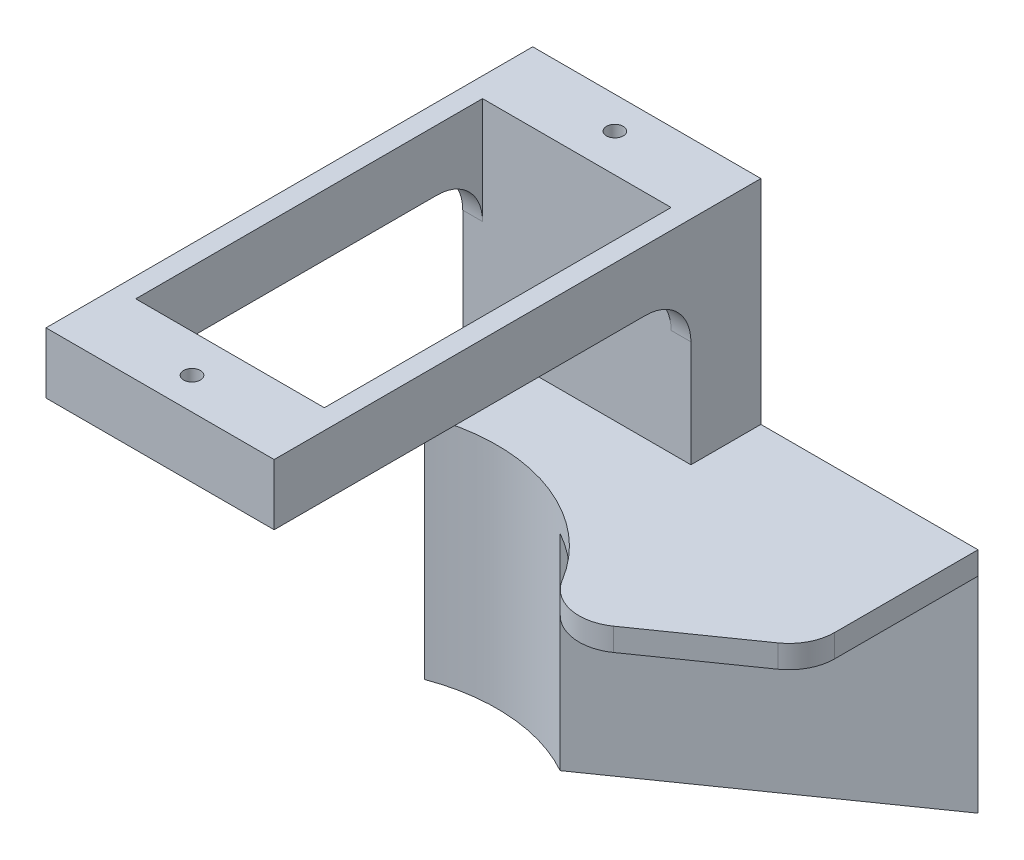
ISO-10303-21;
HEADER;
FILE_DESCRIPTION(('STEP AP214'),'2;1');
FILE_NAME('part.step','',(''),(''),'','','');
FILE_SCHEMA(('AUTOMOTIVE_DESIGN { 1 0 10303 214 1 1 1 1 }'));
ENDSEC;
DATA;
#1=APPLICATION_CONTEXT('core data for automotive mechanical design processes');
#2=APPLICATION_PROTOCOL_DEFINITION('international standard','automotive_design',2000,#1);
#3=PRODUCT_CONTEXT('',#1,'mechanical');
#4=PRODUCT('Part','Part','',(#3));
#5=PRODUCT_RELATED_PRODUCT_CATEGORY('part','',(#4));
#6=PRODUCT_DEFINITION_FORMATION('','',#4);
#7=PRODUCT_DEFINITION_CONTEXT('part definition',#1,'design');
#8=PRODUCT_DEFINITION('design','',#6,#7);
#9=PRODUCT_DEFINITION_SHAPE('','',#8);
#10=(LENGTH_UNIT() NAMED_UNIT(*) SI_UNIT(.MILLI.,.METRE.));
#11=(NAMED_UNIT(*) PLANE_ANGLE_UNIT() SI_UNIT($,.RADIAN.));
#12=(NAMED_UNIT(*) SI_UNIT($,.STERADIAN.) SOLID_ANGLE_UNIT());
#13=UNCERTAINTY_MEASURE_WITH_UNIT(LENGTH_MEASURE(1.E-05),#10,'distance_accuracy_value','');
#14=(GEOMETRIC_REPRESENTATION_CONTEXT(3) GLOBAL_UNCERTAINTY_ASSIGNED_CONTEXT((#13)) GLOBAL_UNIT_ASSIGNED_CONTEXT((#10,
#11,#12)) REPRESENTATION_CONTEXT('',''));
#15=CARTESIAN_POINT('',(0.,0.,0.));
#16=DIRECTION('',(0.,0.,1.));
#17=DIRECTION('',(1.,0.,0.));
#18=AXIS2_PLACEMENT_3D('',#15,#16,#17);
#19=CARTESIAN_POINT('',(0.,-14.5,14.5));
#20=DIRECTION('',(0.,-1.,0.));
#21=DIRECTION('',(1.,0.,0.));
#22=AXIS2_PLACEMENT_3D('',#19,#20,#21);
#23=PLANE('',#22);
#24=DIRECTION('',(1.,0.,0.));
#25=VECTOR('',#24,1.);
#26=CARTESIAN_POINT('',(0.,-14.4999999999999,-1.50000000000005));
#27=LINE('',#26,#25);
#28=CARTESIAN_POINT('',(-7.5,-14.4999999999999,-1.50000000000005));
#29=VERTEX_POINT('',#28);
#30=CARTESIAN_POINT('',(21.7737259658386,-14.4999999999999,-1.50000000000005));
#31=VERTEX_POINT('',#30);
#32=EDGE_CURVE('E258',#29,#31,#27,.T.);
#33=ORIENTED_EDGE('',*,*,#32,.T.);
#34=DIRECTION('',(-0.819152044288991,0.,0.573576436351047));
#35=VECTOR('',#34,1.);
#36=CARTESIAN_POINT('',(-0.354204421152927,-14.5,13.9941436619512));
#37=LINE('',#36,#35);
#38=CARTESIAN_POINT('',(5.61538547792866,-14.5,9.81419181459366));
#39=VERTEX_POINT('',#38);
#40=EDGE_CURVE('E220',#31,#39,#37,.T.);
#41=ORIENTED_EDGE('',*,*,#40,.T.);
#42=CARTESIAN_POINT('',(0.,-14.5,19.85));
#43=DIRECTION('',(0.,-1.,0.));
#44=DIRECTION('',(1.,0.,0.));
#45=AXIS2_PLACEMENT_3D('',#42,#43,#44);
#46=CIRCLE('',#45,11.5);
#47=CARTESIAN_POINT('',(-4.04469791424314,-14.5,9.08475876802948));
#48=VERTEX_POINT('',#47);
#49=EDGE_CURVE('E208',#48,#39,#46,.T.);
#50=ORIENTED_EDGE('',*,*,#49,.F.);
#51=DIRECTION('',(-0.500000000000004,0.,-0.866025403784436));
#52=VECTOR('',#51,1.);
#53=CARTESIAN_POINT('',(-0.688655198428643,-14.5,14.8975952641916));
#54=LINE('',#53,#52);
#55=CARTESIAN_POINT('',(-7.5,-14.5,3.09999999999995));
#56=VERTEX_POINT('',#55);
#57=EDGE_CURVE('E210',#48,#56,#54,.T.);
#58=ORIENTED_EDGE('',*,*,#57,.T.);
#59=DIRECTION('',(0.,0.,-1.));
#60=VECTOR('',#59,1.);
#61=CARTESIAN_POINT('',(-7.5,-14.5,14.4999999999999));
#62=LINE('',#61,#60);
#63=EDGE_CURVE('E249',#56,#29,#62,.T.);
#64=ORIENTED_EDGE('',*,*,#63,.T.);
#65=EDGE_LOOP('',(#33,#41,#50,#58,#64));
#66=FACE_BOUND('',#65,.T.);
#67=ADVANCED_FACE('F47',(#66),#23,.T.);
#68=CARTESIAN_POINT('',(4.8079835060065,-49.0987169715613,21.366512060552));
#69=DIRECTION('',(0.573576436351047,0.,0.819152044288991));
#70=DIRECTION('',(-0.819152044288991,0.,0.573576436351047));
#71=AXIS2_PLACEMENT_3D('',#68,#69,#70);
#72=PLANE('',#71);
#73=DIRECTION('',(-0.819152044288991,0.,0.573576436351047));
#74=VECTOR('',#73,1.);
#75=CARTESIAN_POINT('',(4.8079835060065,-1.00000000000003,21.3665120605521));
#76=LINE('',#75,#74);
#77=CARTESIAN_POINT('',(20.4944552748917,-0.999999999999987,10.3827262800648));
#78=VERTEX_POINT('',#77);
#79=CARTESIAN_POINT('',(14.1437300983189,-1.,14.8295519217994));
#80=VERTEX_POINT('',#79);
#81=EDGE_CURVE('E203',#78,#80,#76,.T.);
#82=ORIENTED_EDGE('',*,*,#81,.F.);
#83=DIRECTION('',(0.,1.,0.));
#84=VECTOR('',#83,1.);
#85=CARTESIAN_POINT('',(20.4944552748917,-49.0987169715612,10.3827262800647));
#86=LINE('',#85,#84);
#87=CARTESIAN_POINT('',(20.4944552748917,0.500000000000013,10.3827262800649));
#88=VERTEX_POINT('',#87);
#89=EDGE_CURVE('E384',#78,#88,#86,.T.);
#90=ORIENTED_EDGE('',*,*,#89,.T.);
#91=DIRECTION('',(0.819152044288991,0.,-0.573576436351047));
#92=VECTOR('',#91,1.);
#93=CARTESIAN_POINT('',(4.8079835060065,0.499999999999974,21.3665120605521));
#94=LINE('',#93,#92);
#95=CARTESIAN_POINT('',(14.1437300983189,0.499999999999997,14.8295519217994));
#96=VERTEX_POINT('',#95);
#97=EDGE_CURVE('E221',#96,#88,#94,.T.);
#98=ORIENTED_EDGE('',*,*,#97,.F.);
#99=DIRECTION('',(0.,1.,0.));
#100=VECTOR('',#99,1.);
#101=CARTESIAN_POINT('',(14.1437300983189,-49.0987169715613,14.8295519217992));
#102=LINE('',#101,#100);
#103=EDGE_CURVE('E381',#96,#80,#102,.F.);
#104=ORIENTED_EDGE('',*,*,#103,.T.);
#105=EDGE_LOOP('',(#82,#90,#98,#104));
#106=FACE_BOUND('',#105,.T.);
#107=ADVANCED_FACE('F448',(#106),#72,.T.);
#108=CARTESIAN_POINT('',(21.7737259658386,-49.0987169715613,14.4999999999998));
#109=DIRECTION('',(1.,0.,0.));
#110=DIRECTION('',(0.,0.,1.));
#111=AXIS2_PLACEMENT_3D('',#108,#109,#110);
#112=PLANE('',#111);
#113=DIRECTION('',(0.,0.,-1.));
#114=VECTOR('',#113,1.);
#115=CARTESIAN_POINT('',(21.7737259658386,0.499999999999999,14.5));
#116=LINE('',#115,#114);
#117=CARTESIAN_POINT('',(21.7737259658386,0.500000000000021,7.92527014719788));
#118=VERTEX_POINT('',#117);
#119=CARTESIAN_POINT('',(21.7737259658386,0.500000000000054,-1.5));
#120=VERTEX_POINT('',#119);
#121=EDGE_CURVE('E225',#118,#120,#116,.T.);
#122=ORIENTED_EDGE('',*,*,#121,.F.);
#123=DIRECTION('',(0.,1.,0.));
#124=VECTOR('',#123,1.);
#125=CARTESIAN_POINT('',(21.7737259658386,-49.0987169715612,7.92527014719771));
#126=LINE('',#125,#124);
#127=CARTESIAN_POINT('',(21.7737259658386,-0.999999999999978,7.92527014719788));
#128=VERTEX_POINT('',#127);
#129=EDGE_CURVE('E71',#118,#128,#126,.F.);
#130=ORIENTED_EDGE('',*,*,#129,.T.);
#131=DIRECTION('',(0.,0.,1.));
#132=VECTOR('',#131,1.);
#133=CARTESIAN_POINT('',(21.7737259658386,-1.,14.5));
#134=LINE('',#133,#132);
#135=CARTESIAN_POINT('',(21.7737259658386,-0.999999999999945,-1.5));
#136=VERTEX_POINT('',#135);
#137=EDGE_CURVE('E195',#136,#128,#134,.T.);
#138=ORIENTED_EDGE('',*,*,#137,.F.);
#139=DIRECTION('',(0.,1.,0.));
#140=VECTOR('',#139,1.);
#141=CARTESIAN_POINT('',(21.7737259658386,-49.0987169715612,-1.50000000000017));
#142=LINE('',#141,#140);
#143=EDGE_CURVE('E236',#136,#120,#142,.T.);
#144=ORIENTED_EDGE('',*,*,#143,.T.);
#145=EDGE_LOOP('',(#122,#130,#138,#144));
#146=FACE_BOUND('',#145,.T.);
#147=ADVANCED_FACE('F434',(#146),#112,.T.);
#148=CARTESIAN_POINT('',(0.,-49.0987169715613,19.8499999999998));
#149=DIRECTION('',(0.,1.,0.));
#150=DIRECTION('',(-1.,0.,0.));
#151=AXIS2_PLACEMENT_3D('',#148,#149,#150);
#152=CYLINDRICAL_SURFACE('',#151,11.5);
#153=CARTESIAN_POINT('',(0.,-1.00000000000002,19.85));
#154=DIRECTION('',(0.,-1.,0.));
#155=DIRECTION('',(1.,0.,0.));
#156=AXIS2_PLACEMENT_3D('',#153,#154,#155);
#157=CIRCLE('',#156,11.5);
#158=CARTESIAN_POINT('',(5.61538547792866,-0.999999999999985,9.81419181459371));
#159=VERTEX_POINT('',#158);
#160=CARTESIAN_POINT('',(9.85272476390041,-0.999999999999999,13.9192483843257));
#161=VERTEX_POINT('',#160);
#162=EDGE_CURVE('E196',#159,#161,#157,.T.);
#163=ORIENTED_EDGE('',*,*,#162,.T.);
#164=DIRECTION('',(0.,1.,0.));
#165=VECTOR('',#164,1.);
#166=CARTESIAN_POINT('',(9.85272476390042,-49.0987169715613,13.9192483843255));
#167=LINE('',#166,#165);
#168=CARTESIAN_POINT('',(9.85272476390041,0.5,13.9192483843257));
#169=VERTEX_POINT('',#168);
#170=EDGE_CURVE('E401',#161,#169,#167,.T.);
#171=ORIENTED_EDGE('',*,*,#170,.T.);
#172=CARTESIAN_POINT('',(0.,0.49999999999998,19.85));
#173=DIRECTION('',(0.,-1.,0.));
#174=DIRECTION('',(1.,0.,0.));
#175=AXIS2_PLACEMENT_3D('',#172,#173,#174);
#176=CIRCLE('',#175,11.5);
#177=CARTESIAN_POINT('',(-4.04469791424314,0.500000000000018,9.08475876802953));
#178=VERTEX_POINT('',#177);
#179=EDGE_CURVE('E215',#178,#169,#176,.T.);
#180=ORIENTED_EDGE('',*,*,#179,.F.);
#181=DIRECTION('',(0.,1.,0.));
#182=VECTOR('',#181,1.);
#183=CARTESIAN_POINT('',(-4.04469791424314,-49.0987169715612,9.08475876802935));
#184=LINE('',#183,#182);
#185=EDGE_CURVE('E240',#48,#178,#184,.T.);
#186=ORIENTED_EDGE('',*,*,#185,.F.);
#187=ORIENTED_EDGE('',*,*,#49,.T.);
#188=DIRECTION('',(0.,-1.,0.));
#189=VECTOR('',#188,1.);
#190=CARTESIAN_POINT('',(5.61538547792866,-0.999999999999985,9.81419181459371));
#191=LINE('',#190,#189);
#192=EDGE_CURVE('E190',#159,#39,#191,.T.);
#193=ORIENTED_EDGE('',*,*,#192,.F.);
#194=EDGE_LOOP('',(#163,#171,#180,#186,#187,#193));
#195=FACE_BOUND('',#194,.T.);
#196=ADVANCED_FACE('F206',(#195),#152,.F.);
#197=CARTESIAN_POINT('',(7.5,10.4999999999999,30.5));
#198=DIRECTION('',(-1.,0.,0.));
#199=DIRECTION('',(0.,0.,-1.));
#200=AXIS2_PLACEMENT_3D('',#197,#198,#199);
#201=PLANE('',#200);
#202=DIRECTION('',(0.,0.,1.));
#203=VECTOR('',#202,1.);
#204=CARTESIAN_POINT('',(7.5,0.499999999999999,14.5));
#205=LINE('',#204,#203);
#206=CARTESIAN_POINT('',(7.5,0.500000000000054,-1.5));
#207=VERTEX_POINT('',#206);
#208=CARTESIAN_POINT('',(7.5,0.500000000000039,3.1));
#209=VERTEX_POINT('',#208);
#210=EDGE_CURVE('E232',#207,#209,#205,.T.);
#211=ORIENTED_EDGE('',*,*,#210,.F.);
#212=DIRECTION('',(0.,1.,0.));
#213=VECTOR('',#212,1.);
#214=CARTESIAN_POINT('',(7.5,10.5000000000001,-1.49999999999996));
#215=LINE('',#214,#213);
#216=CARTESIAN_POINT('',(7.5,14.5000000000001,-1.49999999999995));
#217=VERTEX_POINT('',#216);
#218=EDGE_CURVE('E339',#207,#217,#215,.T.);
#219=ORIENTED_EDGE('',*,*,#218,.T.);
#220=DIRECTION('',(0.,0.,1.));
#221=VECTOR('',#220,1.);
#222=CARTESIAN_POINT('',(7.5,14.4999999999999,30.5));
#223=LINE('',#222,#221);
#224=CARTESIAN_POINT('',(7.5,14.4999999999999,30.5));
#225=VERTEX_POINT('',#224);
#226=EDGE_CURVE('E327',#217,#225,#223,.T.);
#227=ORIENTED_EDGE('',*,*,#226,.T.);
#228=DIRECTION('',(0.,1.,0.));
#229=VECTOR('',#228,1.);
#230=CARTESIAN_POINT('',(7.5,10.4999999999999,30.5));
#231=LINE('',#230,#229);
#232=CARTESIAN_POINT('',(7.5,10.4999999999999,30.5));
#233=VERTEX_POINT('',#232);
#234=EDGE_CURVE('E362',#233,#225,#231,.T.);
#235=ORIENTED_EDGE('',*,*,#234,.F.);
#236=DIRECTION('',(0.,0.,1.));
#237=VECTOR('',#236,1.);
#238=CARTESIAN_POINT('',(7.5,10.4999999999999,30.5));
#239=LINE('',#238,#237);
#240=CARTESIAN_POINT('',(7.5,10.5,6.10000000000004));
#241=VERTEX_POINT('',#240);
#242=EDGE_CURVE('E328',#241,#233,#239,.T.);
#243=ORIENTED_EDGE('',*,*,#242,.F.);
#244=CARTESIAN_POINT('',(7.5,7.50000000000003,6.10000000000003));
#245=DIRECTION('',(-1.,0.,0.));
#246=DIRECTION('',(0.,0.,-1.));
#247=AXIS2_PLACEMENT_3D('',#244,#245,#246);
#248=CIRCLE('',#247,3.);
#249=CARTESIAN_POINT('',(7.5,7.50000000000004,3.10000000000003));
#250=VERTEX_POINT('',#249);
#251=EDGE_CURVE('E404',#241,#250,#248,.T.);
#252=ORIENTED_EDGE('',*,*,#251,.T.);
#253=DIRECTION('',(0.,1.,0.));
#254=VECTOR('',#253,1.);
#255=CARTESIAN_POINT('',(7.5,-14.5,3.09999999999995));
#256=LINE('',#255,#254);
#257=EDGE_CURVE('E262',#209,#250,#256,.T.);
#258=ORIENTED_EDGE('',*,*,#257,.F.);
#259=EDGE_LOOP('',(#211,#219,#227,#235,#243,#252,#258));
#260=FACE_BOUND('',#259,.T.);
#261=ADVANCED_FACE('F463',(#260),#201,.F.);
#262=CARTESIAN_POINT('',(-6.2,10.5,3.10000000000004));
#263=DIRECTION('',(0.,0.,1.));
#264=DIRECTION('',(0.,-1.,0.));
#265=AXIS2_PLACEMENT_3D('',#262,#263,#264);
#266=PLANE('',#265);
#267=ORIENTED_EDGE('',*,*,#257,.T.);
#268=DIRECTION('',(1.,0.,0.));
#269=VECTOR('',#268,1.);
#270=CARTESIAN_POINT('',(6.2,7.50000000000004,3.10000000000003));
#271=LINE('',#270,#269);
#272=CARTESIAN_POINT('',(6.2,7.50000000000004,3.10000000000003));
#273=VERTEX_POINT('',#272);
#274=EDGE_CURVE('E377',#250,#273,#271,.F.);
#275=ORIENTED_EDGE('',*,*,#274,.T.);
#276=DIRECTION('',(0.,1.,0.));
#277=VECTOR('',#276,1.);
#278=CARTESIAN_POINT('',(6.2,10.5,3.10000000000004));
#279=LINE('',#278,#277);
#280=CARTESIAN_POINT('',(6.2,14.5,3.10000000000005));
#281=VERTEX_POINT('',#280);
#282=EDGE_CURVE('E299',#273,#281,#279,.T.);
#283=ORIENTED_EDGE('',*,*,#282,.T.);
#284=DIRECTION('',(1.,0.,0.));
#285=VECTOR('',#284,1.);
#286=CARTESIAN_POINT('',(-6.2,14.5,3.10000000000005));
#287=LINE('',#286,#285);
#288=CARTESIAN_POINT('',(-6.2,14.5,3.10000000000005));
#289=VERTEX_POINT('',#288);
#290=EDGE_CURVE('E292',#289,#281,#287,.T.);
#291=ORIENTED_EDGE('',*,*,#290,.F.);
#292=DIRECTION('',(0.,1.,0.));
#293=VECTOR('',#292,1.);
#294=CARTESIAN_POINT('',(-6.2,10.5,3.10000000000004));
#295=LINE('',#294,#293);
#296=CARTESIAN_POINT('',(-6.2,7.50000000000004,3.10000000000003));
#297=VERTEX_POINT('',#296);
#298=EDGE_CURVE('E317',#297,#289,#295,.T.);
#299=ORIENTED_EDGE('',*,*,#298,.F.);
#300=DIRECTION('',(1.,0.,0.));
#301=VECTOR('',#300,1.);
#302=CARTESIAN_POINT('',(-7.5,7.50000000000004,3.10000000000003));
#303=LINE('',#302,#301);
#304=CARTESIAN_POINT('',(-7.5,7.50000000000004,3.10000000000003));
#305=VERTEX_POINT('',#304);
#306=EDGE_CURVE('E374',#297,#305,#303,.F.);
#307=ORIENTED_EDGE('',*,*,#306,.T.);
#308=DIRECTION('',(0.,1.,0.));
#309=VECTOR('',#308,1.);
#310=CARTESIAN_POINT('',(-7.5,-14.5,3.09999999999995));
#311=LINE('',#310,#309);
#312=CARTESIAN_POINT('',(-7.5,0.500000000000039,3.1));
#313=VERTEX_POINT('',#312);
#314=EDGE_CURVE('E266',#313,#305,#311,.T.);
#315=ORIENTED_EDGE('',*,*,#314,.F.);
#316=DIRECTION('',(1.,0.,0.));
#317=VECTOR('',#316,1.);
#318=CARTESIAN_POINT('',(0.,0.500000000000039,3.1));
#319=LINE('',#318,#317);
#320=EDGE_CURVE('E237',#313,#209,#319,.T.);
#321=ORIENTED_EDGE('',*,*,#320,.T.);
#322=EDGE_LOOP('',(#267,#275,#283,#291,#299,#307,#315,#321));
#323=FACE_BOUND('',#322,.T.);
#324=ADVANCED_FACE('F424',(#323),#266,.T.);
#325=CARTESIAN_POINT('',(0.,10.5,14.5));
#326=DIRECTION('',(0.,-1.,0.));
#327=DIRECTION('',(1.,0.,0.));
#328=AXIS2_PLACEMENT_3D('',#325,#326,#327);
#329=PLANE('',#328);
#330=CARTESIAN_POINT('',(0.,10.5,28.4));
#331=DIRECTION('',(0.,-1.,0.));
#332=DIRECTION('',(1.,0.,0.));
#333=AXIS2_PLACEMENT_3D('',#330,#331,#332);
#334=CIRCLE('',#333,0.55);
#335=CARTESIAN_POINT('',(0.550000000000005,10.5,28.4));
#336=VERTEX_POINT('',#335);
#337=EDGE_CURVE('E280',#336,#336,#334,.T.);
#338=ORIENTED_EDGE('',*,*,#337,.F.);
#339=EDGE_LOOP('',(#338));
#340=FACE_BOUND('',#339,.T.);
#341=DIRECTION('',(0.,0.,1.));
#342=VECTOR('',#341,1.);
#343=CARTESIAN_POINT('',(6.2,10.5,25.9));
#344=LINE('',#343,#342);
#345=CARTESIAN_POINT('',(6.2,10.5,6.10000000000004));
#346=VERTEX_POINT('',#345);
#347=CARTESIAN_POINT('',(6.2,10.5,25.9));
#348=VERTEX_POINT('',#347);
#349=EDGE_CURVE('E288',#346,#348,#344,.T.);
#350=ORIENTED_EDGE('',*,*,#349,.F.);
#351=DIRECTION('',(1.,0.,0.));
#352=VECTOR('',#351,1.);
#353=CARTESIAN_POINT('',(7.5,10.5,6.10000000000004));
#354=LINE('',#353,#352);
#355=EDGE_CURVE('E370',#346,#241,#354,.T.);
#356=ORIENTED_EDGE('',*,*,#355,.T.);
#357=ORIENTED_EDGE('',*,*,#242,.T.);
#358=DIRECTION('',(-1.,0.,0.));
#359=VECTOR('',#358,1.);
#360=CARTESIAN_POINT('',(-7.5,10.4999999999999,30.5));
#361=LINE('',#360,#359);
#362=CARTESIAN_POINT('',(-7.5,10.4999999999999,30.5));
#363=VERTEX_POINT('',#362);
#364=EDGE_CURVE('E331',#233,#363,#361,.T.);
#365=ORIENTED_EDGE('',*,*,#364,.T.);
#366=DIRECTION('',(0.,0.,-1.));
#367=VECTOR('',#366,1.);
#368=CARTESIAN_POINT('',(-7.5,10.4999999999999,30.5));
#369=LINE('',#368,#367);
#370=CARTESIAN_POINT('',(-7.5,10.5,6.10000000000004));
#371=VERTEX_POINT('',#370);
#372=EDGE_CURVE('E335',#363,#371,#369,.T.);
#373=ORIENTED_EDGE('',*,*,#372,.T.);
#374=DIRECTION('',(1.,0.,0.));
#375=VECTOR('',#374,1.);
#376=CARTESIAN_POINT('',(-6.2,10.5,6.10000000000004));
#377=LINE('',#376,#375);
#378=CARTESIAN_POINT('',(-6.2,10.5,6.10000000000004));
#379=VERTEX_POINT('',#378);
#380=EDGE_CURVE('E366',#371,#379,#377,.T.);
#381=ORIENTED_EDGE('',*,*,#380,.T.);
#382=DIRECTION('',(0.,0.,-1.));
#383=VECTOR('',#382,1.);
#384=CARTESIAN_POINT('',(-6.2,10.5,25.9));
#385=LINE('',#384,#383);
#386=CARTESIAN_POINT('',(-6.2,10.5,25.9));
#387=VERTEX_POINT('',#386);
#388=EDGE_CURVE('E295',#387,#379,#385,.T.);
#389=ORIENTED_EDGE('',*,*,#388,.F.);
#390=DIRECTION('',(-1.,0.,0.));
#391=VECTOR('',#390,1.);
#392=CARTESIAN_POINT('',(-6.2,10.5,25.9));
#393=LINE('',#392,#391);
#394=EDGE_CURVE('E291',#348,#387,#393,.T.);
#395=ORIENTED_EDGE('',*,*,#394,.F.);
#396=EDGE_LOOP('',(#350,#356,#357,#365,#373,#381,#389,#395));
#397=FACE_BOUND('',#396,.T.);
#398=ADVANCED_FACE('F477',(#340,#397),#329,.T.);
#399=CARTESIAN_POINT('',(0.,14.5,14.5000000000001));
#400=DIRECTION('',(0.,-1.,0.));
#401=DIRECTION('',(1.,0.,0.));
#402=AXIS2_PLACEMENT_3D('',#399,#400,#401);
#403=PLANE('',#402);
#404=ORIENTED_EDGE('',*,*,#226,.F.);
#405=DIRECTION('',(1.,0.,0.));
#406=VECTOR('',#405,1.);
#407=CARTESIAN_POINT('',(-7.5,14.5000000000001,-1.49999999999995));
#408=LINE('',#407,#406);
#409=CARTESIAN_POINT('',(-7.5,14.5000000000001,-1.49999999999995));
#410=VERTEX_POINT('',#409);
#411=EDGE_CURVE('E332',#410,#217,#408,.T.);
#412=ORIENTED_EDGE('',*,*,#411,.F.);
#413=DIRECTION('',(0.,0.,-1.));
#414=VECTOR('',#413,1.);
#415=CARTESIAN_POINT('',(-7.5,14.4999999999999,30.5));
#416=LINE('',#415,#414);
#417=CARTESIAN_POINT('',(-7.5,14.4999999999999,30.5));
#418=VERTEX_POINT('',#417);
#419=EDGE_CURVE('E346',#418,#410,#416,.T.);
#420=ORIENTED_EDGE('',*,*,#419,.F.);
#421=DIRECTION('',(-1.,0.,0.));
#422=VECTOR('',#421,1.);
#423=CARTESIAN_POINT('',(-7.5,14.4999999999999,30.5));
#424=LINE('',#423,#422);
#425=EDGE_CURVE('E343',#225,#418,#424,.T.);
#426=ORIENTED_EDGE('',*,*,#425,.F.);
#427=EDGE_LOOP('',(#404,#412,#420,#426));
#428=FACE_BOUND('',#427,.T.);
#429=DIRECTION('',(0.,0.,1.));
#430=VECTOR('',#429,1.);
#431=CARTESIAN_POINT('',(6.2,14.5,25.9000000000001));
#432=LINE('',#431,#430);
#433=CARTESIAN_POINT('',(6.2,14.5,25.9000000000001));
#434=VERTEX_POINT('',#433);
#435=EDGE_CURVE('E284',#281,#434,#432,.T.);
#436=ORIENTED_EDGE('',*,*,#435,.T.);
#437=DIRECTION('',(-1.,0.,0.));
#438=VECTOR('',#437,1.);
#439=CARTESIAN_POINT('',(-6.2,14.5,25.9000000000001));
#440=LINE('',#439,#438);
#441=CARTESIAN_POINT('',(-6.2,14.5,25.9000000000001));
#442=VERTEX_POINT('',#441);
#443=EDGE_CURVE('E303',#434,#442,#440,.T.);
#444=ORIENTED_EDGE('',*,*,#443,.T.);
#445=DIRECTION('',(0.,0.,-1.));
#446=VECTOR('',#445,1.);
#447=CARTESIAN_POINT('',(-6.2,14.5,25.9000000000001));
#448=LINE('',#447,#446);
#449=EDGE_CURVE('E307',#442,#289,#448,.T.);
#450=ORIENTED_EDGE('',*,*,#449,.T.);
#451=ORIENTED_EDGE('',*,*,#290,.T.);
#452=EDGE_LOOP('',(#436,#444,#450,#451));
#453=FACE_BOUND('',#452,.T.);
#454=CARTESIAN_POINT('',(0.,14.5,28.4000000000001));
#455=DIRECTION('',(0.,-1.,0.));
#456=DIRECTION('',(1.,0.,0.));
#457=AXIS2_PLACEMENT_3D('',#454,#455,#456);
#458=CIRCLE('',#457,0.55);
#459=CARTESIAN_POINT('',(0.550000000000005,14.5,28.4000000000001));
#460=VERTEX_POINT('',#459);
#461=EDGE_CURVE('E279',#460,#460,#458,.T.);
#462=ORIENTED_EDGE('',*,*,#461,.T.);
#463=EDGE_LOOP('',(#462));
#464=FACE_BOUND('',#463,.T.);
#465=CARTESIAN_POINT('',(0.,14.5,0.60000000000005));
#466=DIRECTION('',(0.,-1.,0.));
#467=DIRECTION('',(1.,0.,0.));
#468=AXIS2_PLACEMENT_3D('',#465,#466,#467);
#469=CIRCLE('',#468,0.55);
#470=CARTESIAN_POINT('',(0.550000000000005,14.5,0.60000000000005));
#471=VERTEX_POINT('',#470);
#472=EDGE_CURVE('E275',#471,#471,#469,.T.);
#473=ORIENTED_EDGE('',*,*,#472,.T.);
#474=EDGE_LOOP('',(#473));
#475=FACE_BOUND('',#474,.T.);
#476=ADVANCED_FACE('F459',(#428,#453,#464,#475),#403,.F.);
#477=CARTESIAN_POINT('',(-7.5,10.4999999999999,30.5));
#478=DIRECTION('',(0.,0.,-1.));
#479=DIRECTION('',(0.,1.,0.));
#480=AXIS2_PLACEMENT_3D('',#477,#478,#479);
#481=PLANE('',#480);
#482=ORIENTED_EDGE('',*,*,#425,.T.);
#483=DIRECTION('',(0.,1.,0.));
#484=VECTOR('',#483,1.);
#485=CARTESIAN_POINT('',(-7.5,10.4999999999999,30.5));
#486=LINE('',#485,#484);
#487=EDGE_CURVE('E358',#363,#418,#486,.T.);
#488=ORIENTED_EDGE('',*,*,#487,.F.);
#489=ORIENTED_EDGE('',*,*,#364,.F.);
#490=ORIENTED_EDGE('',*,*,#234,.T.);
#491=EDGE_LOOP('',(#482,#488,#489,#490));
#492=FACE_BOUND('',#491,.T.);
#493=ADVANCED_FACE('F482',(#492),#481,.F.);
#494=CARTESIAN_POINT('',(-7.5,10.4999999999999,30.5));
#495=DIRECTION('',(1.,0.,0.));
#496=DIRECTION('',(0.,0.,1.));
#497=AXIS2_PLACEMENT_3D('',#494,#495,#496);
#498=PLANE('',#497);
#499=ORIENTED_EDGE('',*,*,#419,.T.);
#500=DIRECTION('',(0.,1.,0.));
#501=VECTOR('',#500,1.);
#502=CARTESIAN_POINT('',(-7.5,10.5000000000001,-1.49999999999996));
#503=LINE('',#502,#501);
#504=EDGE_CURVE('E354',#29,#410,#503,.T.);
#505=ORIENTED_EDGE('',*,*,#504,.F.);
#506=ORIENTED_EDGE('',*,*,#63,.F.);
#507=EDGE_CURVE('E267',#56,#313,#311,.T.);
#508=ORIENTED_EDGE('',*,*,#507,.T.);
#509=ORIENTED_EDGE('',*,*,#314,.T.);
#510=CARTESIAN_POINT('',(-7.5,7.50000000000003,6.10000000000003));
#511=DIRECTION('',(1.,0.,0.));
#512=DIRECTION('',(0.,0.,1.));
#513=AXIS2_PLACEMENT_3D('',#510,#511,#512);
#514=CIRCLE('',#513,3.);
#515=EDGE_CURVE('E11',#305,#371,#514,.T.);
#516=ORIENTED_EDGE('',*,*,#515,.T.);
#517=ORIENTED_EDGE('',*,*,#372,.F.);
#518=ORIENTED_EDGE('',*,*,#487,.T.);
#519=EDGE_LOOP('',(#499,#505,#506,#508,#509,#516,#517,#518));
#520=FACE_BOUND('',#519,.T.);
#521=ADVANCED_FACE('F426',(#520),#498,.F.);
#522=CARTESIAN_POINT('',(-7.5,10.5000000000001,-1.49999999999996));
#523=DIRECTION('',(0.,0.,1.));
#524=DIRECTION('',(0.,-1.,0.));
#525=AXIS2_PLACEMENT_3D('',#522,#523,#524);
#526=PLANE('',#525);
#527=ORIENTED_EDGE('',*,*,#411,.T.);
#528=ORIENTED_EDGE('',*,*,#218,.F.);
#529=DIRECTION('',(-1.,0.,0.));
#530=VECTOR('',#529,1.);
#531=CARTESIAN_POINT('',(0.,0.500000000000054,-1.5));
#532=LINE('',#531,#530);
#533=EDGE_CURVE('E228',#120,#207,#532,.T.);
#534=ORIENTED_EDGE('',*,*,#533,.F.);
#535=ORIENTED_EDGE('',*,*,#143,.F.);
#536=EDGE_CURVE('E193',#31,#136,#142,.T.);
#537=ORIENTED_EDGE('',*,*,#536,.F.);
#538=ORIENTED_EDGE('',*,*,#32,.F.);
#539=ORIENTED_EDGE('',*,*,#504,.T.);
#540=EDGE_LOOP('',(#527,#528,#534,#535,#537,#538,#539));
#541=FACE_BOUND('',#540,.T.);
#542=ADVANCED_FACE('F437',(#541),#526,.F.);
#543=CARTESIAN_POINT('',(6.2,10.5,25.9));
#544=DIRECTION('',(-1.,0.,0.));
#545=DIRECTION('',(0.,0.,-1.));
#546=AXIS2_PLACEMENT_3D('',#543,#544,#545);
#547=PLANE('',#546);
#548=ORIENTED_EDGE('',*,*,#435,.F.);
#549=ORIENTED_EDGE('',*,*,#282,.F.);
#550=CARTESIAN_POINT('',(6.2,7.50000000000003,6.10000000000003));
#551=DIRECTION('',(-1.,0.,0.));
#552=DIRECTION('',(0.,0.,-1.));
#553=AXIS2_PLACEMENT_3D('',#550,#551,#552);
#554=CIRCLE('',#553,3.);
#555=EDGE_CURVE('E407',#273,#346,#554,.F.);
#556=ORIENTED_EDGE('',*,*,#555,.T.);
#557=ORIENTED_EDGE('',*,*,#349,.T.);
#558=DIRECTION('',(0.,1.,0.));
#559=VECTOR('',#558,1.);
#560=CARTESIAN_POINT('',(6.2,10.5,25.9));
#561=LINE('',#560,#559);
#562=EDGE_CURVE('E323',#348,#434,#561,.T.);
#563=ORIENTED_EDGE('',*,*,#562,.T.);
#564=EDGE_LOOP('',(#548,#549,#556,#557,#563));
#565=FACE_BOUND('',#564,.T.);
#566=ADVANCED_FACE('F473',(#565),#547,.T.);
#567=CARTESIAN_POINT('',(-6.2,10.5,25.9));
#568=DIRECTION('',(0.,0.,-1.));
#569=DIRECTION('',(0.,1.,0.));
#570=AXIS2_PLACEMENT_3D('',#567,#568,#569);
#571=PLANE('',#570);
#572=ORIENTED_EDGE('',*,*,#443,.F.);
#573=ORIENTED_EDGE('',*,*,#562,.F.);
#574=ORIENTED_EDGE('',*,*,#394,.T.);
#575=DIRECTION('',(0.,1.,0.));
#576=VECTOR('',#575,1.);
#577=CARTESIAN_POINT('',(-6.2,10.5,25.9));
#578=LINE('',#577,#576);
#579=EDGE_CURVE('E320',#387,#442,#578,.T.);
#580=ORIENTED_EDGE('',*,*,#579,.T.);
#581=EDGE_LOOP('',(#572,#573,#574,#580));
#582=FACE_BOUND('',#581,.T.);
#583=ADVANCED_FACE('F479',(#582),#571,.T.);
#584=CARTESIAN_POINT('',(-6.2,10.5,25.9));
#585=DIRECTION('',(1.,0.,0.));
#586=DIRECTION('',(0.,0.,1.));
#587=AXIS2_PLACEMENT_3D('',#584,#585,#586);
#588=PLANE('',#587);
#589=ORIENTED_EDGE('',*,*,#449,.F.);
#590=ORIENTED_EDGE('',*,*,#579,.F.);
#591=ORIENTED_EDGE('',*,*,#388,.T.);
#592=CARTESIAN_POINT('',(-6.2,7.50000000000003,6.10000000000003));
#593=DIRECTION('',(1.,0.,0.));
#594=DIRECTION('',(0.,0.,1.));
#595=AXIS2_PLACEMENT_3D('',#592,#593,#594);
#596=CIRCLE('',#595,3.);
#597=EDGE_CURVE('E56',#379,#297,#596,.F.);
#598=ORIENTED_EDGE('',*,*,#597,.T.);
#599=ORIENTED_EDGE('',*,*,#298,.T.);
#600=EDGE_LOOP('',(#589,#590,#591,#598,#599));
#601=FACE_BOUND('',#600,.T.);
#602=ADVANCED_FACE('F414',(#601),#588,.T.);
#603=CARTESIAN_POINT('',(0.,10.5,28.4));
#604=DIRECTION('',(0.,1.,0.));
#605=DIRECTION('',(-1.,0.,0.));
#606=AXIS2_PLACEMENT_3D('',#603,#604,#605);
#607=CYLINDRICAL_SURFACE('',#606,0.55);
#608=ORIENTED_EDGE('',*,*,#337,.T.);
#609=EDGE_LOOP('',(#608));
#610=FACE_BOUND('',#609,.T.);
#611=ORIENTED_EDGE('',*,*,#461,.F.);
#612=EDGE_LOOP('',(#611));
#613=FACE_BOUND('',#612,.T.);
#614=ADVANCED_FACE('F491',(#610,#613),#607,.F.);
#615=CARTESIAN_POINT('',(0.,10.5,0.600000000000036));
#616=DIRECTION('',(0.,1.,0.));
#617=DIRECTION('',(-1.,0.,0.));
#618=AXIS2_PLACEMENT_3D('',#615,#616,#617);
#619=CYLINDRICAL_SURFACE('',#618,0.55);
#620=CARTESIAN_POINT('',(0.,10.5,0.600000000000036));
#621=DIRECTION('',(0.,-1.,0.));
#622=DIRECTION('',(1.,0.,0.));
#623=AXIS2_PLACEMENT_3D('',#620,#621,#622);
#624=CIRCLE('',#623,0.55);
#625=CARTESIAN_POINT('',(0.550000000000005,10.5,0.600000000000036));
#626=VERTEX_POINT('',#625);
#627=EDGE_CURVE('E271',#626,#626,#624,.T.);
#628=ORIENTED_EDGE('',*,*,#627,.T.);
#629=EDGE_LOOP('',(#628));
#630=FACE_BOUND('',#629,.T.);
#631=ORIENTED_EDGE('',*,*,#472,.F.);
#632=EDGE_LOOP('',(#631));
#633=FACE_BOUND('',#632,.T.);
#634=ADVANCED_FACE('F488',(#630,#633),#619,.F.);
#635=CARTESIAN_POINT('',(0.,10.5,14.5));
#636=DIRECTION('',(0.,-1.,0.));
#637=DIRECTION('',(1.,0.,0.));
#638=AXIS2_PLACEMENT_3D('',#635,#636,#637);
#639=PLANE('',#638);
#640=ORIENTED_EDGE('',*,*,#627,.F.);
#641=EDGE_LOOP('',(#640));
#642=FACE_BOUND('',#641,.T.);
#643=ADVANCED_FACE('F490',(#642),#639,.F.);
#644=CARTESIAN_POINT('',(0.,0.499999999999999,14.5));
#645=DIRECTION('',(0.,-1.,0.));
#646=DIRECTION('',(1.,0.,0.));
#647=AXIS2_PLACEMENT_3D('',#644,#645,#646);
#648=PLANE('',#647);
#649=ORIENTED_EDGE('',*,*,#97,.T.);
#650=CARTESIAN_POINT('',(18.7737259658386,0.500000000000025,7.92527014719788));
#651=DIRECTION('',(0.,-1.,0.));
#652=DIRECTION('',(1.,0.,0.));
#653=AXIS2_PLACEMENT_3D('',#650,#651,#652);
#654=CIRCLE('',#653,3.);
#655=EDGE_CURVE('E391',#88,#118,#654,.F.);
#656=ORIENTED_EDGE('',*,*,#655,.T.);
#657=ORIENTED_EDGE('',*,*,#121,.T.);
#658=ORIENTED_EDGE('',*,*,#533,.T.);
#659=ORIENTED_EDGE('',*,*,#210,.T.);
#660=ORIENTED_EDGE('',*,*,#320,.F.);
#661=DIRECTION('',(-0.500000000000004,0.,-0.866025403784436));
#662=VECTOR('',#661,1.);
#663=CARTESIAN_POINT('',(-0.688655198428643,0.499999999999997,14.8975952641916));
#664=LINE('',#663,#662);
#665=EDGE_CURVE('E241',#178,#313,#664,.T.);
#666=ORIENTED_EDGE('',*,*,#665,.F.);
#667=ORIENTED_EDGE('',*,*,#179,.T.);
#668=CARTESIAN_POINT('',(12.4230007892657,0.500000000000009,12.3720957889324));
#669=DIRECTION('',(0.,-1.,0.));
#670=DIRECTION('',(1.,0.,0.));
#671=AXIS2_PLACEMENT_3D('',#668,#669,#670);
#672=CIRCLE('',#671,3.);
#673=EDGE_CURVE('E388',#169,#96,#672,.F.);
#674=ORIENTED_EDGE('',*,*,#673,.T.);
#675=EDGE_LOOP('',(#649,#656,#657,#658,#659,#660,#666,#667,#674));
#676=FACE_BOUND('',#675,.T.);
#677=ADVANCED_FACE('F439',(#676),#648,.F.);
#678=CARTESIAN_POINT('',(-0.688655198428643,-49.0987169715613,14.8975952641914));
#679=DIRECTION('',(0.866025403784436,0.,-0.500000000000004));
#680=DIRECTION('',(0.500000000000004,0.,0.866025403784436));
#681=AXIS2_PLACEMENT_3D('',#678,#679,#680);
#682=PLANE('',#681);
#683=ORIENTED_EDGE('',*,*,#57,.F.);
#684=ORIENTED_EDGE('',*,*,#185,.T.);
#685=ORIENTED_EDGE('',*,*,#665,.T.);
#686=ORIENTED_EDGE('',*,*,#507,.F.);
#687=EDGE_LOOP('',(#683,#684,#685,#686));
#688=FACE_BOUND('',#687,.T.);
#689=ADVANCED_FACE('F511',(#688),#682,.F.);
#690=CARTESIAN_POINT('',(-0.354204421152927,-0.999999999999999,13.9941436619512));
#691=DIRECTION('',(0.573576436351047,0.,0.819152044288991));
#692=DIRECTION('',(-0.819152044288991,0.,0.573576436351047));
#693=AXIS2_PLACEMENT_3D('',#690,#691,#692);
#694=PLANE('',#693);
#695=ORIENTED_EDGE('',*,*,#40,.F.);
#696=ORIENTED_EDGE('',*,*,#536,.T.);
#697=DIRECTION('',(-0.819152044288991,0.,0.573576436351047));
#698=VECTOR('',#697,1.);
#699=CARTESIAN_POINT('',(-0.354204421152927,-0.999999999999999,13.9941436619512));
#700=LINE('',#699,#698);
#701=EDGE_CURVE('E187',#136,#159,#700,.T.);
#702=ORIENTED_EDGE('',*,*,#701,.T.);
#703=ORIENTED_EDGE('',*,*,#192,.T.);
#704=EDGE_LOOP('',(#695,#696,#702,#703));
#705=FACE_BOUND('',#704,.T.);
#706=ADVANCED_FACE('F188',(#705),#694,.T.);
#707=CARTESIAN_POINT('',(0.,-1.00000000000002,19.85));
#708=DIRECTION('',(0.,-1.,0.));
#709=DIRECTION('',(1.,0.,0.));
#710=AXIS2_PLACEMENT_3D('',#707,#708,#709);
#711=PLANE('',#710);
#712=ORIENTED_EDGE('',*,*,#137,.T.);
#713=CARTESIAN_POINT('',(18.7737259658386,-0.999999999999977,7.92527014719788));
#714=DIRECTION('',(0.,-1.,0.));
#715=DIRECTION('',(1.,0.,0.));
#716=AXIS2_PLACEMENT_3D('',#713,#714,#715);
#717=CIRCLE('',#716,3.);
#718=EDGE_CURVE('E398',#128,#78,#717,.T.);
#719=ORIENTED_EDGE('',*,*,#718,.T.);
#720=ORIENTED_EDGE('',*,*,#81,.T.);
#721=CARTESIAN_POINT('',(12.4230007892657,-0.999999999999992,12.3720957889324));
#722=DIRECTION('',(0.,-1.,0.));
#723=DIRECTION('',(1.,0.,0.));
#724=AXIS2_PLACEMENT_3D('',#721,#722,#723);
#725=CIRCLE('',#724,3.);
#726=EDGE_CURVE('E63',#80,#161,#725,.T.);
#727=ORIENTED_EDGE('',*,*,#726,.T.);
#728=ORIENTED_EDGE('',*,*,#162,.F.);
#729=ORIENTED_EDGE('',*,*,#701,.F.);
#730=EDGE_LOOP('',(#712,#719,#720,#727,#728,#729));
#731=FACE_BOUND('',#730,.T.);
#732=ADVANCED_FACE('F198',(#731),#711,.T.);
#733=CARTESIAN_POINT('',(0.,7.50000000000003,6.10000000000003));
#734=DIRECTION('',(-1.,0.,0.));
#735=DIRECTION('',(0.,-1.,0.));
#736=AXIS2_PLACEMENT_3D('',#733,#734,#735);
#737=CYLINDRICAL_SURFACE('',#736,3.);
#738=ORIENTED_EDGE('',*,*,#555,.F.);
#739=ORIENTED_EDGE('',*,*,#274,.F.);
#740=ORIENTED_EDGE('',*,*,#251,.F.);
#741=ORIENTED_EDGE('',*,*,#355,.F.);
#742=EDGE_LOOP('',(#738,#739,#740,#741));
#743=FACE_BOUND('',#742,.T.);
#744=ADVANCED_FACE('F469',(#743),#737,.F.);
#745=CARTESIAN_POINT('',(0.,7.50000000000003,6.10000000000003));
#746=DIRECTION('',(-1.,0.,0.));
#747=DIRECTION('',(0.,-1.,0.));
#748=AXIS2_PLACEMENT_3D('',#745,#746,#747);
#749=CYLINDRICAL_SURFACE('',#748,3.);
#750=ORIENTED_EDGE('',*,*,#515,.F.);
#751=ORIENTED_EDGE('',*,*,#306,.F.);
#752=ORIENTED_EDGE('',*,*,#597,.F.);
#753=ORIENTED_EDGE('',*,*,#380,.F.);
#754=EDGE_LOOP('',(#750,#751,#752,#753));
#755=FACE_BOUND('',#754,.T.);
#756=ADVANCED_FACE('F421',(#755),#749,.F.);
#757=CARTESIAN_POINT('',(18.7737259658386,-49.0987169715612,7.92527014719771));
#758=DIRECTION('',(0.,1.,0.));
#759=DIRECTION('',(-1.,0.,0.));
#760=AXIS2_PLACEMENT_3D('',#757,#758,#759);
#761=CYLINDRICAL_SURFACE('',#760,3.);
#762=ORIENTED_EDGE('',*,*,#718,.F.);
#763=ORIENTED_EDGE('',*,*,#129,.F.);
#764=ORIENTED_EDGE('',*,*,#655,.F.);
#765=ORIENTED_EDGE('',*,*,#89,.F.);
#766=EDGE_LOOP('',(#762,#763,#764,#765));
#767=FACE_BOUND('',#766,.T.);
#768=ADVANCED_FACE('F445',(#767),#761,.T.);
#769=CARTESIAN_POINT('',(12.4230007892657,-49.0987169715612,12.3720957889322));
#770=DIRECTION('',(0.,1.,0.));
#771=DIRECTION('',(-1.,0.,0.));
#772=AXIS2_PLACEMENT_3D('',#769,#770,#771);
#773=CYLINDRICAL_SURFACE('',#772,3.);
#774=ORIENTED_EDGE('',*,*,#726,.F.);
#775=ORIENTED_EDGE('',*,*,#103,.F.);
#776=ORIENTED_EDGE('',*,*,#673,.F.);
#777=ORIENTED_EDGE('',*,*,#170,.F.);
#778=EDGE_LOOP('',(#774,#775,#776,#777));
#779=FACE_BOUND('',#778,.T.);
#780=ADVANCED_FACE('F49',(#779),#773,.T.);
#781=CLOSED_SHELL('',(#67,#107,#147,#196,#261,#324,#398,#476,#493,#521,#542,#566,#583,#602,#614,
#634,#643,#677,#689,#706,#732,#744,#756,#768,#780));
#782=MANIFOLD_SOLID_BREP('B2',#781);
#783=ADVANCED_BREP_SHAPE_REPRESENTATION('',(#18,#782),#14);
#784=SHAPE_DEFINITION_REPRESENTATION(#9,#783);
ENDSEC;
END-ISO-10303-21;
